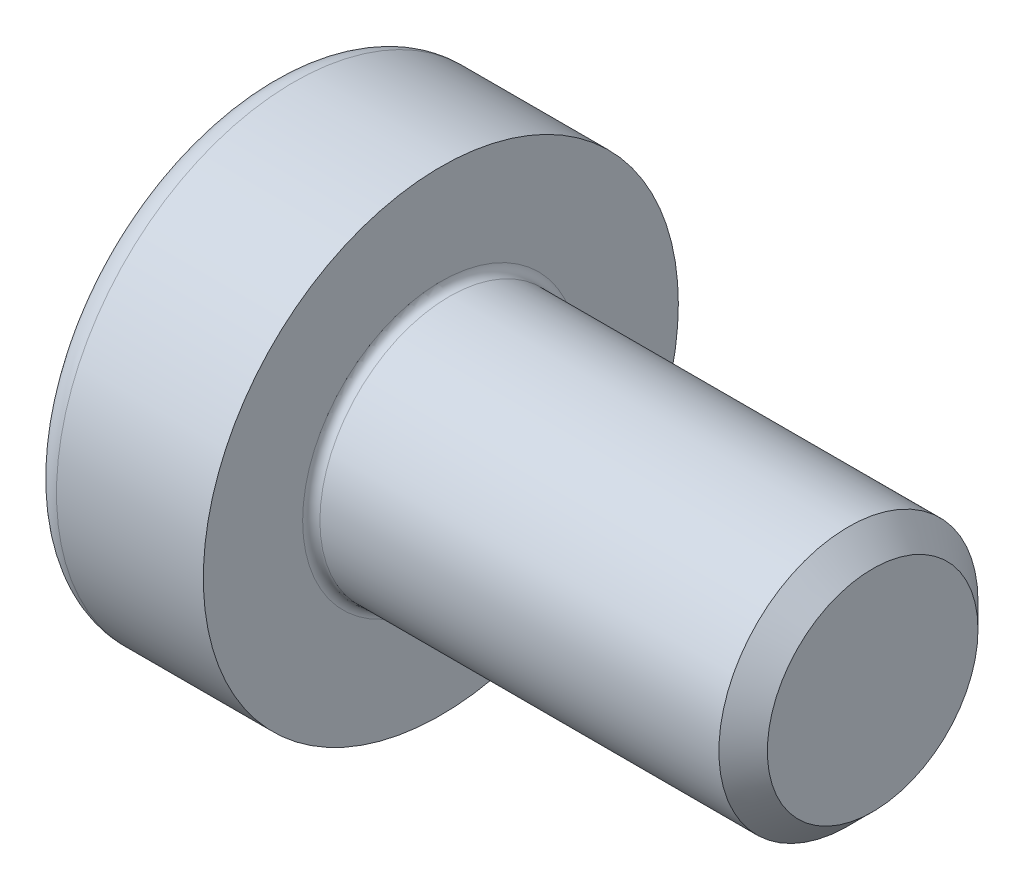
ISO-10303-21;
HEADER;
FILE_DESCRIPTION(('STEP AP214'),'2;1');
FILE_NAME('part.step','',(''),(''),'','','');
FILE_SCHEMA(('AUTOMOTIVE_DESIGN { 1 0 10303 214 1 1 1 1 }'));
ENDSEC;
DATA;
#1=APPLICATION_CONTEXT('core data for automotive mechanical design processes');
#2=APPLICATION_PROTOCOL_DEFINITION('international standard','automotive_design',2000,#1);
#3=PRODUCT_CONTEXT('',#1,'mechanical');
#4=PRODUCT('Part','Part','',(#3));
#5=PRODUCT_RELATED_PRODUCT_CATEGORY('part','',(#4));
#6=PRODUCT_DEFINITION_FORMATION('','',#4);
#7=PRODUCT_DEFINITION_CONTEXT('part definition',#1,'design');
#8=PRODUCT_DEFINITION('design','',#6,#7);
#9=PRODUCT_DEFINITION_SHAPE('','',#8);
#10=(LENGTH_UNIT() NAMED_UNIT(*) SI_UNIT(.MILLI.,.METRE.));
#11=(NAMED_UNIT(*) PLANE_ANGLE_UNIT() SI_UNIT($,.RADIAN.));
#12=(NAMED_UNIT(*) SI_UNIT($,.STERADIAN.) SOLID_ANGLE_UNIT());
#13=UNCERTAINTY_MEASURE_WITH_UNIT(LENGTH_MEASURE(1.E-05),#10,'distance_accuracy_value','');
#14=(GEOMETRIC_REPRESENTATION_CONTEXT(3) GLOBAL_UNCERTAINTY_ASSIGNED_CONTEXT((#13)) GLOBAL_UNIT_ASSIGNED_CONTEXT((#10,
#11,#12)) REPRESENTATION_CONTEXT('',''));
#15=CARTESIAN_POINT('',(0.,0.,0.));
#16=DIRECTION('',(0.,0.,1.));
#17=DIRECTION('',(1.,0.,0.));
#18=AXIS2_PLACEMENT_3D('',#15,#16,#17);
#19=CARTESIAN_POINT('',(1.5,1.73205080756888,-1.));
#20=DIRECTION('',(1.,0.,0.));
#21=DIRECTION('',(0.,1.,0.));
#22=AXIS2_PLACEMENT_3D('',#19,#20,#21);
#23=PLANE('',#22);
#24=DIRECTION('',(0.,-0.5,-0.866025403784438));
#25=VECTOR('',#24,1.);
#26=CARTESIAN_POINT('',(1.5,1.15470053837926,0.));
#27=LINE('',#26,#25);
#28=CARTESIAN_POINT('',(1.5,0.866025403784445,-0.5));
#29=VERTEX_POINT('',#28);
#30=CARTESIAN_POINT('',(1.5,0.57735026918963,-1.));
#31=VERTEX_POINT('',#30);
#32=EDGE_CURVE('E28',#29,#31,#27,.T.);
#33=ORIENTED_EDGE('',*,*,#32,.T.);
#34=DIRECTION('',(0.,-1.,0.));
#35=VECTOR('',#34,1.);
#36=CARTESIAN_POINT('',(1.5,0.57735026918963,-1.));
#37=LINE('',#36,#35);
#38=CARTESIAN_POINT('',(1.5,0.,-1.));
#39=VERTEX_POINT('',#38);
#40=EDGE_CURVE('E206',#31,#39,#37,.T.);
#41=ORIENTED_EDGE('',*,*,#40,.T.);
#42=CARTESIAN_POINT('',(1.5,0.,0.));
#43=DIRECTION('',(-1.,0.,0.));
#44=DIRECTION('',(0.,0.,1.));
#45=AXIS2_PLACEMENT_3D('',#42,#43,#44);
#46=CIRCLE('',#45,1.);
#47=EDGE_CURVE('E21',#29,#39,#46,.T.);
#48=ORIENTED_EDGE('',*,*,#47,.F.);
#49=EDGE_LOOP('',(#33,#41,#48));
#50=FACE_BOUND('',#49,.T.);
#51=ADVANCED_FACE('F17',(#50),#23,.F.);
#52=CARTESIAN_POINT('',(1.5,1.73205080756888,-1.));
#53=DIRECTION('',(1.,0.,0.));
#54=DIRECTION('',(0.,1.,0.));
#55=AXIS2_PLACEMENT_3D('',#52,#53,#54);
#56=PLANE('',#55);
#57=DIRECTION('',(0.,-0.5,0.86602540378444));
#58=VECTOR('',#57,1.);
#59=CARTESIAN_POINT('',(1.5,1.15470053837926,0.));
#60=LINE('',#59,#58);
#61=CARTESIAN_POINT('',(1.5,1.15470053837926,0.));
#62=VERTEX_POINT('',#61);
#63=CARTESIAN_POINT('',(1.5,0.866025403784442,0.5));
#64=VERTEX_POINT('',#63);
#65=EDGE_CURVE('E133',#62,#64,#60,.T.);
#66=ORIENTED_EDGE('',*,*,#65,.F.);
#67=DIRECTION('',(0.,-0.5,-0.866025403784438));
#68=VECTOR('',#67,1.);
#69=CARTESIAN_POINT('',(1.5,1.15470053837926,0.));
#70=LINE('',#69,#68);
#71=EDGE_CURVE('E11',#62,#29,#70,.T.);
#72=ORIENTED_EDGE('',*,*,#71,.T.);
#73=CARTESIAN_POINT('',(1.5,0.,0.));
#74=DIRECTION('',(-1.,0.,0.));
#75=DIRECTION('',(0.,0.,1.));
#76=AXIS2_PLACEMENT_3D('',#73,#74,#75);
#77=CIRCLE('',#76,1.);
#78=EDGE_CURVE('E145',#64,#29,#77,.T.);
#79=ORIENTED_EDGE('',*,*,#78,.F.);
#80=EDGE_LOOP('',(#66,#72,#79));
#81=FACE_BOUND('',#80,.T.);
#82=ADVANCED_FACE('F146',(#81),#56,.F.);
#83=CARTESIAN_POINT('',(1.5,1.73205080756888,-1.));
#84=DIRECTION('',(1.,0.,0.));
#85=DIRECTION('',(0.,1.,0.));
#86=AXIS2_PLACEMENT_3D('',#83,#84,#85);
#87=PLANE('',#86);
#88=DIRECTION('',(0.,1.,0.));
#89=VECTOR('',#88,1.);
#90=CARTESIAN_POINT('',(1.5,-0.577350269189617,1.));
#91=LINE('',#90,#89);
#92=CARTESIAN_POINT('',(1.5,0.,1.));
#93=VERTEX_POINT('',#92);
#94=CARTESIAN_POINT('',(1.5,0.577350269189634,1.));
#95=VERTEX_POINT('',#94);
#96=EDGE_CURVE('E127',#93,#95,#91,.T.);
#97=ORIENTED_EDGE('',*,*,#96,.T.);
#98=DIRECTION('',(0.,-0.5,0.86602540378444));
#99=VECTOR('',#98,1.);
#100=CARTESIAN_POINT('',(1.5,1.15470053837926,0.));
#101=LINE('',#100,#99);
#102=EDGE_CURVE('E120',#64,#95,#101,.T.);
#103=ORIENTED_EDGE('',*,*,#102,.F.);
#104=CARTESIAN_POINT('',(1.5,0.,0.));
#105=DIRECTION('',(-1.,0.,0.));
#106=DIRECTION('',(0.,0.,1.));
#107=AXIS2_PLACEMENT_3D('',#104,#105,#106);
#108=CIRCLE('',#107,1.);
#109=EDGE_CURVE('E124',#93,#64,#108,.T.);
#110=ORIENTED_EDGE('',*,*,#109,.F.);
#111=EDGE_LOOP('',(#97,#103,#110));
#112=FACE_BOUND('',#111,.T.);
#113=ADVANCED_FACE('F122',(#112),#87,.F.);
#114=CARTESIAN_POINT('',(1.5,1.73205080756888,-1.));
#115=DIRECTION('',(1.,0.,0.));
#116=DIRECTION('',(0.,1.,0.));
#117=AXIS2_PLACEMENT_3D('',#114,#115,#116);
#118=PLANE('',#117);
#119=DIRECTION('',(0.,-0.5,-0.866025403784438));
#120=VECTOR('',#119,1.);
#121=CARTESIAN_POINT('',(1.5,-0.577350269189617,1.));
#122=LINE('',#121,#120);
#123=CARTESIAN_POINT('',(1.5,-0.577350269189617,1.));
#124=VERTEX_POINT('',#123);
#125=CARTESIAN_POINT('',(1.5,-0.86602540378443,0.5));
#126=VERTEX_POINT('',#125);
#127=EDGE_CURVE('E220',#124,#126,#122,.T.);
#128=ORIENTED_EDGE('',*,*,#127,.F.);
#129=DIRECTION('',(0.,1.,0.));
#130=VECTOR('',#129,1.);
#131=CARTESIAN_POINT('',(1.5,-0.577350269189617,1.));
#132=LINE('',#131,#130);
#133=EDGE_CURVE('E253',#124,#93,#132,.T.);
#134=ORIENTED_EDGE('',*,*,#133,.T.);
#135=CARTESIAN_POINT('',(1.5,0.,0.));
#136=DIRECTION('',(-1.,0.,0.));
#137=DIRECTION('',(0.,0.,1.));
#138=AXIS2_PLACEMENT_3D('',#135,#136,#137);
#139=CIRCLE('',#138,1.);
#140=EDGE_CURVE('E155',#126,#93,#139,.T.);
#141=ORIENTED_EDGE('',*,*,#140,.F.);
#142=EDGE_LOOP('',(#128,#134,#141));
#143=FACE_BOUND('',#142,.T.);
#144=ADVANCED_FACE('F479',(#143),#118,.F.);
#145=CARTESIAN_POINT('',(1.5,1.73205080756888,-1.));
#146=DIRECTION('',(1.,0.,0.));
#147=DIRECTION('',(0.,1.,0.));
#148=AXIS2_PLACEMENT_3D('',#145,#146,#147);
#149=PLANE('',#148);
#150=DIRECTION('',(0.,0.5,-0.86602540378444));
#151=VECTOR('',#150,1.);
#152=CARTESIAN_POINT('',(1.5,-1.15470053837924,0.));
#153=LINE('',#152,#151);
#154=CARTESIAN_POINT('',(1.5,-1.15470053837924,0.));
#155=VERTEX_POINT('',#154);
#156=CARTESIAN_POINT('',(1.5,-0.866025403784437,-0.5));
#157=VERTEX_POINT('',#156);
#158=EDGE_CURVE('E204',#155,#157,#153,.T.);
#159=ORIENTED_EDGE('',*,*,#158,.F.);
#160=DIRECTION('',(0.,-0.5,-0.866025403784438));
#161=VECTOR('',#160,1.);
#162=CARTESIAN_POINT('',(1.5,-0.577350269189617,1.));
#163=LINE('',#162,#161);
#164=EDGE_CURVE('E205',#126,#155,#163,.T.);
#165=ORIENTED_EDGE('',*,*,#164,.F.);
#166=CARTESIAN_POINT('',(1.5,0.,0.));
#167=DIRECTION('',(-1.,0.,0.));
#168=DIRECTION('',(0.,0.,1.));
#169=AXIS2_PLACEMENT_3D('',#166,#167,#168);
#170=CIRCLE('',#169,1.);
#171=EDGE_CURVE('E162',#157,#126,#170,.T.);
#172=ORIENTED_EDGE('',*,*,#171,.F.);
#173=EDGE_LOOP('',(#159,#165,#172));
#174=FACE_BOUND('',#173,.T.);
#175=ADVANCED_FACE('F476',(#174),#149,.F.);
#176=CARTESIAN_POINT('',(1.5,1.73205080756888,-1.));
#177=DIRECTION('',(1.,0.,0.));
#178=DIRECTION('',(0.,1.,0.));
#179=AXIS2_PLACEMENT_3D('',#176,#177,#178);
#180=PLANE('',#179);
#181=DIRECTION('',(0.,-1.,0.));
#182=VECTOR('',#181,1.);
#183=CARTESIAN_POINT('',(1.5,0.57735026918963,-1.));
#184=LINE('',#183,#182);
#185=CARTESIAN_POINT('',(1.5,-0.577350269189621,-1.));
#186=VERTEX_POINT('',#185);
#187=EDGE_CURVE('E210',#39,#186,#184,.T.);
#188=ORIENTED_EDGE('',*,*,#187,.T.);
#189=DIRECTION('',(0.,0.5,-0.86602540378444));
#190=VECTOR('',#189,1.);
#191=CARTESIAN_POINT('',(1.5,-1.15470053837924,0.));
#192=LINE('',#191,#190);
#193=EDGE_CURVE('E238',#157,#186,#192,.T.);
#194=ORIENTED_EDGE('',*,*,#193,.F.);
#195=CARTESIAN_POINT('',(1.5,0.,0.));
#196=DIRECTION('',(-1.,0.,0.));
#197=DIRECTION('',(0.,0.,1.));
#198=AXIS2_PLACEMENT_3D('',#195,#196,#197);
#199=CIRCLE('',#198,1.);
#200=EDGE_CURVE('E192',#39,#157,#199,.T.);
#201=ORIENTED_EDGE('',*,*,#200,.F.);
#202=EDGE_LOOP('',(#188,#194,#201));
#203=FACE_BOUND('',#202,.T.);
#204=ADVANCED_FACE('F487',(#203),#180,.F.);
#205=CARTESIAN_POINT('',(1.5,1.15470053837926,0.));
#206=DIRECTION('',(0.,0.866025403784438,-0.5));
#207=DIRECTION('',(-1.,0.,0.));
#208=AXIS2_PLACEMENT_3D('',#205,#206,#207);
#209=PLANE('',#208);
#210=DIRECTION('',(0.,-0.5,-0.866025403784438));
#211=VECTOR('',#210,1.);
#212=CARTESIAN_POINT('',(0.,1.15470053837926,0.));
#213=LINE('',#212,#211);
#214=CARTESIAN_POINT('',(0.,1.15470053837926,0.));
#215=VERTEX_POINT('',#214);
#216=CARTESIAN_POINT('',(0.,0.57735026918963,-1.));
#217=VERTEX_POINT('',#216);
#218=EDGE_CURVE('E185',#215,#217,#213,.T.);
#219=ORIENTED_EDGE('',*,*,#218,.T.);
#220=DIRECTION('',(-1.,0.,0.));
#221=VECTOR('',#220,1.);
#222=CARTESIAN_POINT('',(1.5,0.57735026918963,-1.));
#223=LINE('',#222,#221);
#224=EDGE_CURVE('E209',#31,#217,#223,.T.);
#225=ORIENTED_EDGE('',*,*,#224,.F.);
#226=ORIENTED_EDGE('',*,*,#32,.F.);
#227=ORIENTED_EDGE('',*,*,#71,.F.);
#228=DIRECTION('',(-1.,0.,0.));
#229=VECTOR('',#228,1.);
#230=CARTESIAN_POINT('',(1.5,1.15470053837926,0.));
#231=LINE('',#230,#229);
#232=EDGE_CURVE('E140',#62,#215,#231,.T.);
#233=ORIENTED_EDGE('',*,*,#232,.T.);
#234=EDGE_LOOP('',(#219,#225,#226,#227,#233));
#235=FACE_BOUND('',#234,.T.);
#236=ADVANCED_FACE('F341',(#235),#209,.F.);
#237=CARTESIAN_POINT('',(1.5,0.57735026918963,-1.));
#238=DIRECTION('',(0.,0.,-1.));
#239=DIRECTION('',(0.,-1.,0.));
#240=AXIS2_PLACEMENT_3D('',#237,#238,#239);
#241=PLANE('',#240);
#242=DIRECTION('',(0.,-1.,0.));
#243=VECTOR('',#242,1.);
#244=CARTESIAN_POINT('',(0.,0.57735026918963,-1.));
#245=LINE('',#244,#243);
#246=CARTESIAN_POINT('',(0.,-0.577350269189621,-1.));
#247=VERTEX_POINT('',#246);
#248=EDGE_CURVE('E199',#217,#247,#245,.T.);
#249=ORIENTED_EDGE('',*,*,#248,.T.);
#250=DIRECTION('',(-1.,0.,0.));
#251=VECTOR('',#250,1.);
#252=CARTESIAN_POINT('',(1.5,-0.577350269189621,-1.));
#253=LINE('',#252,#251);
#254=EDGE_CURVE('E242',#186,#247,#253,.T.);
#255=ORIENTED_EDGE('',*,*,#254,.F.);
#256=ORIENTED_EDGE('',*,*,#187,.F.);
#257=ORIENTED_EDGE('',*,*,#40,.F.);
#258=ORIENTED_EDGE('',*,*,#224,.T.);
#259=EDGE_LOOP('',(#249,#255,#256,#257,#258));
#260=FACE_BOUND('',#259,.T.);
#261=ADVANCED_FACE('F605',(#260),#241,.F.);
#262=CARTESIAN_POINT('',(1.5,-1.15470053837924,0.));
#263=DIRECTION('',(0.,0.86602540378444,0.5));
#264=DIRECTION('',(1.,0.,0.));
#265=AXIS2_PLACEMENT_3D('',#262,#263,#264);
#266=PLANE('',#265);
#267=DIRECTION('',(0.,0.5,-0.86602540378444));
#268=VECTOR('',#267,1.);
#269=CARTESIAN_POINT('',(0.,-1.15470053837924,0.));
#270=LINE('',#269,#268);
#271=CARTESIAN_POINT('',(0.,-1.15470053837924,0.));
#272=VERTEX_POINT('',#271);
#273=EDGE_CURVE('E235',#272,#247,#270,.T.);
#274=ORIENTED_EDGE('',*,*,#273,.F.);
#275=DIRECTION('',(-1.,0.,0.));
#276=VECTOR('',#275,1.);
#277=CARTESIAN_POINT('',(1.5,-1.15470053837924,0.));
#278=LINE('',#277,#276);
#279=EDGE_CURVE('E200',#155,#272,#278,.T.);
#280=ORIENTED_EDGE('',*,*,#279,.F.);
#281=ORIENTED_EDGE('',*,*,#158,.T.);
#282=ORIENTED_EDGE('',*,*,#193,.T.);
#283=ORIENTED_EDGE('',*,*,#254,.T.);
#284=EDGE_LOOP('',(#274,#280,#281,#282,#283));
#285=FACE_BOUND('',#284,.T.);
#286=ADVANCED_FACE('F318',(#285),#266,.T.);
#287=CARTESIAN_POINT('',(1.5,-0.577350269189617,1.));
#288=DIRECTION('',(0.,0.866025403784438,-0.5));
#289=DIRECTION('',(-1.,0.,0.));
#290=AXIS2_PLACEMENT_3D('',#287,#288,#289);
#291=PLANE('',#290);
#292=DIRECTION('',(0.,-0.5,-0.866025403784438));
#293=VECTOR('',#292,1.);
#294=CARTESIAN_POINT('',(0.,-0.577350269189617,1.));
#295=LINE('',#294,#293);
#296=CARTESIAN_POINT('',(0.,-0.577350269189617,1.));
#297=VERTEX_POINT('',#296);
#298=EDGE_CURVE('E181',#297,#272,#295,.T.);
#299=ORIENTED_EDGE('',*,*,#298,.F.);
#300=DIRECTION('',(-1.,0.,0.));
#301=VECTOR('',#300,1.);
#302=CARTESIAN_POINT('',(1.5,-0.577350269189617,1.));
#303=LINE('',#302,#301);
#304=EDGE_CURVE('E256',#124,#297,#303,.T.);
#305=ORIENTED_EDGE('',*,*,#304,.F.);
#306=ORIENTED_EDGE('',*,*,#127,.T.);
#307=ORIENTED_EDGE('',*,*,#164,.T.);
#308=ORIENTED_EDGE('',*,*,#279,.T.);
#309=EDGE_LOOP('',(#299,#305,#306,#307,#308));
#310=FACE_BOUND('',#309,.T.);
#311=ADVANCED_FACE('F477',(#310),#291,.T.);
#312=CARTESIAN_POINT('',(1.5,-0.577350269189617,1.));
#313=DIRECTION('',(0.,0.,1.));
#314=DIRECTION('',(0.,-1.,0.));
#315=AXIS2_PLACEMENT_3D('',#312,#313,#314);
#316=PLANE('',#315);
#317=DIRECTION('',(0.,1.,0.));
#318=VECTOR('',#317,1.);
#319=CARTESIAN_POINT('',(0.,-0.577350269189617,1.));
#320=LINE('',#319,#318);
#321=CARTESIAN_POINT('',(0.,0.577350269189634,1.));
#322=VERTEX_POINT('',#321);
#323=EDGE_CURVE('E177',#297,#322,#320,.T.);
#324=ORIENTED_EDGE('',*,*,#323,.T.);
#325=DIRECTION('',(-1.,0.,0.));
#326=VECTOR('',#325,1.);
#327=CARTESIAN_POINT('',(1.5,0.577350269189634,1.));
#328=LINE('',#327,#326);
#329=EDGE_CURVE('E132',#95,#322,#328,.T.);
#330=ORIENTED_EDGE('',*,*,#329,.F.);
#331=ORIENTED_EDGE('',*,*,#96,.F.);
#332=ORIENTED_EDGE('',*,*,#133,.F.);
#333=ORIENTED_EDGE('',*,*,#304,.T.);
#334=EDGE_LOOP('',(#324,#330,#331,#332,#333));
#335=FACE_BOUND('',#334,.T.);
#336=ADVANCED_FACE('F337',(#335),#316,.F.);
#337=CARTESIAN_POINT('',(1.5,1.15470053837926,0.));
#338=DIRECTION('',(0.,-0.86602540378444,-0.5));
#339=DIRECTION('',(0.,0.5,-0.86602540378444));
#340=AXIS2_PLACEMENT_3D('',#337,#338,#339);
#341=PLANE('',#340);
#342=DIRECTION('',(0.,-0.5,0.86602540378444));
#343=VECTOR('',#342,1.);
#344=CARTESIAN_POINT('',(0.,1.15470053837926,0.));
#345=LINE('',#344,#343);
#346=EDGE_CURVE('E182',#215,#322,#345,.T.);
#347=ORIENTED_EDGE('',*,*,#346,.F.);
#348=ORIENTED_EDGE('',*,*,#232,.F.);
#349=ORIENTED_EDGE('',*,*,#65,.T.);
#350=ORIENTED_EDGE('',*,*,#102,.T.);
#351=ORIENTED_EDGE('',*,*,#329,.T.);
#352=EDGE_LOOP('',(#347,#348,#349,#350,#351));
#353=FACE_BOUND('',#352,.T.);
#354=ADVANCED_FACE('F139',(#353),#341,.T.);
#355=CARTESIAN_POINT('',(7.,1.2195,0.));
#356=DIRECTION('',(1.,0.,0.));
#357=DIRECTION('',(0.,1.,0.));
#358=AXIS2_PLACEMENT_3D('',#355,#356,#357);
#359=PLANE('',#358);
#360=CARTESIAN_POINT('',(7.,0.,0.));
#361=DIRECTION('',(-1.,0.,0.));
#362=DIRECTION('',(0.,0.,1.));
#363=AXIS2_PLACEMENT_3D('',#360,#361,#362);
#364=CIRCLE('',#363,1.2195);
#365=CARTESIAN_POINT('',(7.,0.,-1.2195));
#366=VERTEX_POINT('',#365);
#367=EDGE_CURVE('E216',#366,#366,#364,.T.);
#368=ORIENTED_EDGE('',*,*,#367,.F.);
#369=EDGE_LOOP('',(#368));
#370=FACE_BOUND('',#369,.T.);
#371=ADVANCED_FACE('F503',(#370),#359,.T.);
#372=CARTESIAN_POINT('',(2.,2.75,0.));
#373=DIRECTION('',(1.,0.,0.));
#374=DIRECTION('',(0.,1.,0.));
#375=AXIS2_PLACEMENT_3D('',#372,#373,#374);
#376=PLANE('',#375);
#377=CARTESIAN_POINT('',(2.,0.,0.));
#378=DIRECTION('',(-1.,0.,0.));
#379=DIRECTION('',(0.,0.,-1.));
#380=AXIS2_PLACEMENT_3D('',#377,#378,#379);
#381=CIRCLE('',#380,1.6);
#382=CARTESIAN_POINT('',(2.,0.,1.6));
#383=VERTEX_POINT('',#382);
#384=EDGE_CURVE('E167',#383,#383,#381,.T.);
#385=ORIENTED_EDGE('',*,*,#384,.T.);
#386=EDGE_LOOP('',(#385));
#387=FACE_BOUND('',#386,.T.);
#388=CARTESIAN_POINT('',(2.,0.,0.));
#389=DIRECTION('',(-1.,0.,0.));
#390=DIRECTION('',(0.,0.,1.));
#391=AXIS2_PLACEMENT_3D('',#388,#389,#390);
#392=CIRCLE('',#391,2.75);
#393=CARTESIAN_POINT('',(2.,0.,-2.75));
#394=VERTEX_POINT('',#393);
#395=EDGE_CURVE('E246',#394,#394,#392,.T.);
#396=ORIENTED_EDGE('',*,*,#395,.F.);
#397=EDGE_LOOP('',(#396));
#398=FACE_BOUND('',#397,.T.);
#399=ADVANCED_FACE('F500',(#387,#398),#376,.T.);
#400=CARTESIAN_POINT('',(0.,0.,0.));
#401=DIRECTION('',(-1.,0.,0.));
#402=DIRECTION('',(0.,0.,1.));
#403=AXIS2_PLACEMENT_3D('',#400,#401,#402);
#404=PLANE('',#403);
#405=ORIENTED_EDGE('',*,*,#346,.T.);
#406=ORIENTED_EDGE('',*,*,#323,.F.);
#407=ORIENTED_EDGE('',*,*,#298,.T.);
#408=ORIENTED_EDGE('',*,*,#273,.T.);
#409=ORIENTED_EDGE('',*,*,#248,.F.);
#410=ORIENTED_EDGE('',*,*,#218,.F.);
#411=EDGE_LOOP('',(#405,#406,#407,#408,#409,#410));
#412=FACE_BOUND('',#411,.T.);
#413=CARTESIAN_POINT('',(0.,0.,0.));
#414=DIRECTION('',(-1.,0.,0.));
#415=DIRECTION('',(0.,0.,1.));
#416=AXIS2_PLACEMENT_3D('',#413,#414,#415);
#417=CIRCLE('',#416,2.45);
#418=CARTESIAN_POINT('',(0.,0.,-2.45));
#419=VERTEX_POINT('',#418);
#420=EDGE_CURVE('E229',#419,#419,#417,.T.);
#421=ORIENTED_EDGE('',*,*,#420,.T.);
#422=EDGE_LOOP('',(#421));
#423=FACE_BOUND('',#422,.T.);
#424=ADVANCED_FACE('F311',(#412,#423),#404,.T.);
#425=CARTESIAN_POINT('',(-31.75,0.,0.));
#426=DIRECTION('',(-1.,0.,0.));
#427=DIRECTION('',(0.,0.,1.));
#428=AXIS2_PLACEMENT_3D('',#425,#426,#427);
#429=CYLINDRICAL_SURFACE('',#428,2.75);
#430=CARTESIAN_POINT('',(0.3,0.,0.));
#431=DIRECTION('',(1.,0.,0.));
#432=DIRECTION('',(0.,0.,1.));
#433=AXIS2_PLACEMENT_3D('',#430,#431,#432);
#434=CIRCLE('',#433,2.75);
#435=CARTESIAN_POINT('',(0.3,0.,-2.75));
#436=VERTEX_POINT('',#435);
#437=EDGE_CURVE('E186',#436,#436,#434,.T.);
#438=ORIENTED_EDGE('',*,*,#437,.T.);
#439=DIRECTION('',(1.,0.,0.));
#440=VECTOR('',#439,1.);
#441=CARTESIAN_POINT('',(-31.75,0.,-2.75));
#442=LINE('',#441,#440);
#443=EDGE_CURVE('E249',#436,#394,#442,.T.);
#444=ORIENTED_EDGE('',*,*,#443,.T.);
#445=ORIENTED_EDGE('',*,*,#395,.T.);
#446=ORIENTED_EDGE('',*,*,#443,.F.);
#447=EDGE_LOOP('',(#438,#444,#445,#446));
#448=FACE_BOUND('',#447,.T.);
#449=ADVANCED_FACE('F508',(#448),#429,.T.);
#450=CARTESIAN_POINT('',(-31.75,0.,0.));
#451=DIRECTION('',(-1.,0.,0.));
#452=DIRECTION('',(0.,0.,1.));
#453=AXIS2_PLACEMENT_3D('',#450,#451,#452);
#454=CYLINDRICAL_SURFACE('',#453,1.5);
#455=CARTESIAN_POINT('',(2.1,0.,0.));
#456=DIRECTION('',(1.,0.,0.));
#457=DIRECTION('',(0.,0.,-1.));
#458=AXIS2_PLACEMENT_3D('',#455,#456,#457);
#459=CIRCLE('',#458,1.5);
#460=CARTESIAN_POINT('',(2.1,0.,-1.5));
#461=VERTEX_POINT('',#460);
#462=CARTESIAN_POINT('',(2.1,0.,1.5));
#463=VERTEX_POINT('',#462);
#464=EDGE_CURVE('E190',#461,#463,#459,.T.);
#465=ORIENTED_EDGE('',*,*,#464,.T.);
#466=CARTESIAN_POINT('',(2.1,0.,0.));
#467=DIRECTION('',(1.,0.,0.));
#468=DIRECTION('',(0.,0.,-1.));
#469=AXIS2_PLACEMENT_3D('',#466,#467,#468);
#470=CIRCLE('',#469,1.5);
#471=EDGE_CURVE('E225',#463,#461,#470,.T.);
#472=ORIENTED_EDGE('',*,*,#471,.T.);
#473=DIRECTION('',(1.,0.,0.));
#474=VECTOR('',#473,1.);
#475=CARTESIAN_POINT('',(-31.75,0.,-1.5));
#476=LINE('',#475,#474);
#477=CARTESIAN_POINT('',(6.7195,0.,-1.5));
#478=VERTEX_POINT('',#477);
#479=EDGE_CURVE('E257',#461,#478,#476,.T.);
#480=ORIENTED_EDGE('',*,*,#479,.T.);
#481=CARTESIAN_POINT('',(6.7195,0.,0.));
#482=DIRECTION('',(-1.,0.,0.));
#483=DIRECTION('',(0.,0.,1.));
#484=AXIS2_PLACEMENT_3D('',#481,#482,#483);
#485=CIRCLE('',#484,1.5);
#486=EDGE_CURVE('E171',#478,#478,#485,.T.);
#487=ORIENTED_EDGE('',*,*,#486,.T.);
#488=ORIENTED_EDGE('',*,*,#479,.F.);
#489=EDGE_LOOP('',(#465,#472,#480,#487,#488));
#490=FACE_BOUND('',#489,.T.);
#491=ADVANCED_FACE('F19',(#490),#454,.T.);
#492=CARTESIAN_POINT('',(7.,0.,0.));
#493=DIRECTION('',(-1.,0.,0.));
#494=DIRECTION('',(0.,0.,1.));
#495=AXIS2_PLACEMENT_3D('',#492,#493,#494);
#496=CONICAL_SURFACE('',#495,1.2195,0.785398163397454);
#497=ORIENTED_EDGE('',*,*,#486,.F.);
#498=DIRECTION('',(0.707106781186543,0.,0.707106781186552));
#499=VECTOR('',#498,1.);
#500=CARTESIAN_POINT('',(7.,0.,-1.2195));
#501=LINE('',#500,#499);
#502=EDGE_CURVE('E176',#478,#366,#501,.T.);
#503=ORIENTED_EDGE('',*,*,#502,.T.);
#504=ORIENTED_EDGE('',*,*,#367,.T.);
#505=ORIENTED_EDGE('',*,*,#502,.F.);
#506=EDGE_LOOP('',(#497,#503,#504,#505));
#507=FACE_BOUND('',#506,.T.);
#508=ADVANCED_FACE('F517',(#507),#496,.T.);
#509=CARTESIAN_POINT('',(2.1,0.,0.));
#510=DIRECTION('',(1.,0.,0.));
#511=DIRECTION('',(0.,0.,-1.));
#512=AXIS2_PLACEMENT_3D('',#509,#510,#511);
#513=TOROIDAL_SURFACE('',#512,1.6,0.1);
#514=ORIENTED_EDGE('',*,*,#464,.F.);
#515=ORIENTED_EDGE('',*,*,#471,.F.);
#516=CARTESIAN_POINT('',(2.1,0.,1.6));
#517=DIRECTION('',(0.,1.,0.));
#518=DIRECTION('',(0.,0.,1.));
#519=AXIS2_PLACEMENT_3D('',#516,#517,#518);
#520=CIRCLE('',#519,0.1);
#521=EDGE_CURVE('E172',#463,#383,#520,.T.);
#522=ORIENTED_EDGE('',*,*,#521,.T.);
#523=ORIENTED_EDGE('',*,*,#384,.F.);
#524=ORIENTED_EDGE('',*,*,#521,.F.);
#525=EDGE_LOOP('',(#514,#515,#522,#523,#524));
#526=FACE_BOUND('',#525,.T.);
#527=ADVANCED_FACE('F514',(#526),#513,.F.);
#528=CARTESIAN_POINT('',(0.3,0.,0.));
#529=DIRECTION('',(-1.,0.,0.));
#530=DIRECTION('',(0.,0.,1.));
#531=AXIS2_PLACEMENT_3D('',#528,#529,#530);
#532=TOROIDAL_SURFACE('',#531,2.45,0.3);
#533=ORIENTED_EDGE('',*,*,#420,.F.);
#534=CARTESIAN_POINT('',(0.3,0.,-2.45));
#535=DIRECTION('',(0.,-1.,0.));
#536=DIRECTION('',(0.,0.,-1.));
#537=AXIS2_PLACEMENT_3D('',#534,#535,#536);
#538=CIRCLE('',#537,0.3);
#539=EDGE_CURVE('E191',#419,#436,#538,.T.);
#540=ORIENTED_EDGE('',*,*,#539,.T.);
#541=ORIENTED_EDGE('',*,*,#437,.F.);
#542=ORIENTED_EDGE('',*,*,#539,.F.);
#543=EDGE_LOOP('',(#533,#540,#541,#542));
#544=FACE_BOUND('',#543,.T.);
#545=ADVANCED_FACE('F499',(#544),#532,.T.);
#546=CARTESIAN_POINT('',(1.5,0.,0.));
#547=DIRECTION('',(-1.,0.,0.));
#548=DIRECTION('',(0.,0.,1.));
#549=AXIS2_PLACEMENT_3D('',#546,#547,#548);
#550=CONICAL_SURFACE('',#549,1.,1.04719755119659);
#551=DIRECTION('',(-0.500000000000006,0.,-0.866025403784435));
#552=VECTOR('',#551,1.);
#553=CARTESIAN_POINT('',(1.5,0.,-1.));
#554=LINE('',#553,#552);
#555=CARTESIAN_POINT('',(2.07735026918963,0.,0.));
#556=VERTEX_POINT('',#555);
#557=EDGE_CURVE('E166',#556,#39,#554,.T.);
#558=ORIENTED_EDGE('',*,*,#557,.T.);
#559=ORIENTED_EDGE('',*,*,#200,.T.);
#560=ORIENTED_EDGE('',*,*,#171,.T.);
#561=ORIENTED_EDGE('',*,*,#140,.T.);
#562=ORIENTED_EDGE('',*,*,#109,.T.);
#563=ORIENTED_EDGE('',*,*,#78,.T.);
#564=ORIENTED_EDGE('',*,*,#47,.T.);
#565=ORIENTED_EDGE('',*,*,#557,.F.);
#566=EDGE_LOOP('',(#558,#559,#560,#561,#562,#563,#564,#565));
#567=FACE_BOUND('',#566,.T.);
#568=ADVANCED_FACE('F152',(#567),#550,.F.);
#569=CLOSED_SHELL('',(#51,#82,#113,#144,#175,#204,#236,#261,#286,#311,#336,#354,#371,#399,#424,
#449,#491,#508,#527,#545,#568));
#570=MANIFOLD_SOLID_BREP('B1',#569);
#571=ADVANCED_BREP_SHAPE_REPRESENTATION('',(#18,#570),#14);
#572=SHAPE_DEFINITION_REPRESENTATION(#9,#571);
ENDSEC;
END-ISO-10303-21;
